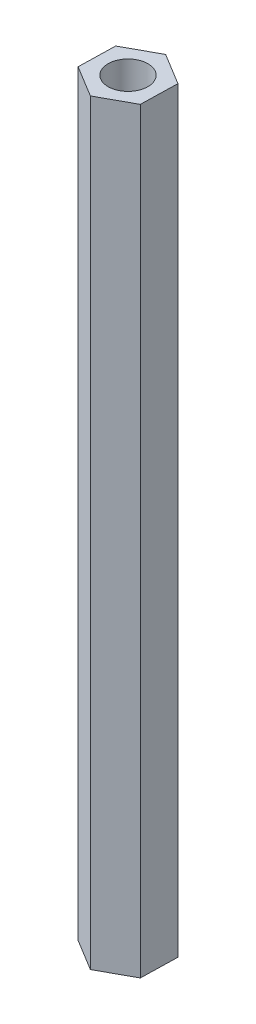
ISO-10303-21;
HEADER;
FILE_DESCRIPTION(('STEP AP214'),'2;1');
FILE_NAME('part.step','',(''),(''),'','','');
FILE_SCHEMA(('AUTOMOTIVE_DESIGN { 1 0 10303 214 1 1 1 1 }'));
ENDSEC;
DATA;
#1=APPLICATION_CONTEXT('core data for automotive mechanical design processes');
#2=APPLICATION_PROTOCOL_DEFINITION('international standard','automotive_design',2000,#1);
#3=PRODUCT_CONTEXT('',#1,'mechanical');
#4=PRODUCT('Part','Part','',(#3));
#5=PRODUCT_RELATED_PRODUCT_CATEGORY('part','',(#4));
#6=PRODUCT_DEFINITION_FORMATION('','',#4);
#7=PRODUCT_DEFINITION_CONTEXT('part definition',#1,'design');
#8=PRODUCT_DEFINITION('design','',#6,#7);
#9=PRODUCT_DEFINITION_SHAPE('','',#8);
#10=(LENGTH_UNIT() NAMED_UNIT(*) SI_UNIT(.MILLI.,.METRE.));
#11=(NAMED_UNIT(*) PLANE_ANGLE_UNIT() SI_UNIT($,.RADIAN.));
#12=(NAMED_UNIT(*) SI_UNIT($,.STERADIAN.) SOLID_ANGLE_UNIT());
#13=UNCERTAINTY_MEASURE_WITH_UNIT(LENGTH_MEASURE(1.E-05),#10,'distance_accuracy_value','');
#14=(GEOMETRIC_REPRESENTATION_CONTEXT(3) GLOBAL_UNCERTAINTY_ASSIGNED_CONTEXT((#13)) GLOBAL_UNIT_ASSIGNED_CONTEXT((#10,
#11,#12)) REPRESENTATION_CONTEXT('',''));
#15=CARTESIAN_POINT('',(0.,0.,0.));
#16=DIRECTION('',(0.,0.,1.));
#17=DIRECTION('',(1.,0.,0.));
#18=AXIS2_PLACEMENT_3D('',#15,#16,#17);
#19=CARTESIAN_POINT('',(3.94579096412522,47.5,2.4008471423148));
#20=DIRECTION('',(-0.999735132754464,0.,-0.0230144375645834));
#21=DIRECTION('',(-0.0230144375645834,0.,0.999735132754464));
#22=AXIS2_PLACEMENT_3D('',#19,#20,#21);
#23=PLANE('',#22);
#24=DIRECTION('',(0.0230144375645834,0.,-0.999735132754464));
#25=VECTOR('',#24,1.);
#26=CARTESIAN_POINT('',(3.94579096412522,-47.5,2.4008471423148));
#27=LINE('',#26,#25);
#28=CARTESIAN_POINT('',(3.94579096412522,-47.5,2.4008471423148));
#29=VERTEX_POINT('',#28);
#30=CARTESIAN_POINT('',(4.0520900979105,-47.5,-2.21673164179813));
#31=VERTEX_POINT('',#30);
#32=EDGE_CURVE('E125',#29,#31,#27,.T.);
#33=ORIENTED_EDGE('',*,*,#32,.T.);
#34=DIRECTION('',(0.,-1.,0.));
#35=VECTOR('',#34,1.);
#36=CARTESIAN_POINT('',(4.0520900979105,47.5,-2.21673164179813));
#37=LINE('',#36,#35);
#38=CARTESIAN_POINT('',(4.0520900979105,47.5,-2.21673164179813));
#39=VERTEX_POINT('',#38);
#40=EDGE_CURVE('E11',#39,#31,#37,.T.);
#41=ORIENTED_EDGE('',*,*,#40,.F.);
#42=DIRECTION('',(0.0230144375645834,0.,-0.999735132754464));
#43=VECTOR('',#42,1.);
#44=CARTESIAN_POINT('',(3.94579096412522,47.5,2.4008471423148));
#45=LINE('',#44,#43);
#46=CARTESIAN_POINT('',(3.94579096412522,47.5,2.4008471423148));
#47=VERTEX_POINT('',#46);
#48=EDGE_CURVE('E136',#47,#39,#45,.T.);
#49=ORIENTED_EDGE('',*,*,#48,.F.);
#50=DIRECTION('',(0.,-1.,0.));
#51=VECTOR('',#50,1.);
#52=CARTESIAN_POINT('',(3.94579096412522,47.5,2.4008471423148));
#53=LINE('',#52,#51);
#54=EDGE_CURVE('E121',#47,#29,#53,.T.);
#55=ORIENTED_EDGE('',*,*,#54,.T.);
#56=EDGE_LOOP('',(#33,#41,#49,#55));
#57=FACE_BOUND('',#56,.T.);
#58=ADVANCED_FACE('F39',(#57),#23,.F.);
#59=CARTESIAN_POINT('',(4.0520900979105,47.5,-2.21673164179813));
#60=DIRECTION('',(-0.519798653961972,0.,0.854288803238882));
#61=DIRECTION('',(0.854288803238882,0.,0.519798653961972));
#62=AXIS2_PLACEMENT_3D('',#59,#60,#61);
#63=PLANE('',#62);
#64=DIRECTION('',(-0.854288803238882,0.,-0.519798653961972));
#65=VECTOR('',#64,1.);
#66=CARTESIAN_POINT('',(4.0520900979105,-47.5,-2.21673164179813));
#67=LINE('',#66,#65);
#68=CARTESIAN_POINT('',(0.106299133785283,-47.5,-4.61757878411293));
#69=VERTEX_POINT('',#68);
#70=EDGE_CURVE('E128',#31,#69,#67,.T.);
#71=ORIENTED_EDGE('',*,*,#70,.T.);
#72=DIRECTION('',(0.,-1.,0.));
#73=VECTOR('',#72,1.);
#74=CARTESIAN_POINT('',(0.106299133785283,47.5,-4.61757878411293));
#75=LINE('',#74,#73);
#76=CARTESIAN_POINT('',(0.106299133785283,47.5,-4.61757878411293));
#77=VERTEX_POINT('',#76);
#78=EDGE_CURVE('E48',#77,#69,#75,.T.);
#79=ORIENTED_EDGE('',*,*,#78,.F.);
#80=DIRECTION('',(-0.854288803238882,0.,-0.519798653961972));
#81=VECTOR('',#80,1.);
#82=CARTESIAN_POINT('',(4.0520900979105,47.5,-2.21673164179813));
#83=LINE('',#82,#81);
#84=EDGE_CURVE('E94',#39,#77,#83,.T.);
#85=ORIENTED_EDGE('',*,*,#84,.F.);
#86=ORIENTED_EDGE('',*,*,#40,.T.);
#87=EDGE_LOOP('',(#71,#79,#85,#86));
#88=FACE_BOUND('',#87,.T.);
#89=ADVANCED_FACE('F156',(#88),#63,.F.);
#90=CARTESIAN_POINT('',(0.106299133785283,47.5,-4.61757878411293));
#91=DIRECTION('',(0.479936478792491,0.,0.877303240803466));
#92=DIRECTION('',(0.877303240803466,0.,-0.479936478792491));
#93=AXIS2_PLACEMENT_3D('',#90,#91,#92);
#94=PLANE('',#93);
#95=DIRECTION('',(-0.877303240803466,0.,0.479936478792491));
#96=VECTOR('',#95,1.);
#97=CARTESIAN_POINT('',(0.106299133785283,-47.5,-4.61757878411293));
#98=LINE('',#97,#96);
#99=CARTESIAN_POINT('',(-3.94579096412522,-47.5,-2.4008471423148));
#100=VERTEX_POINT('',#99);
#101=EDGE_CURVE('E131',#69,#100,#98,.T.);
#102=ORIENTED_EDGE('',*,*,#101,.T.);
#103=DIRECTION('',(0.,-1.,0.));
#104=VECTOR('',#103,1.);
#105=CARTESIAN_POINT('',(-3.94579096412522,47.5,-2.4008471423148));
#106=LINE('',#105,#104);
#107=CARTESIAN_POINT('',(-3.94579096412522,47.5,-2.4008471423148));
#108=VERTEX_POINT('',#107);
#109=EDGE_CURVE('E116',#108,#100,#106,.T.);
#110=ORIENTED_EDGE('',*,*,#109,.F.);
#111=DIRECTION('',(-0.877303240803466,0.,0.479936478792491));
#112=VECTOR('',#111,1.);
#113=CARTESIAN_POINT('',(0.106299133785283,47.5,-4.61757878411293));
#114=LINE('',#113,#112);
#115=EDGE_CURVE('E107',#77,#108,#114,.T.);
#116=ORIENTED_EDGE('',*,*,#115,.F.);
#117=ORIENTED_EDGE('',*,*,#78,.T.);
#118=EDGE_LOOP('',(#102,#110,#116,#117));
#119=FACE_BOUND('',#118,.T.);
#120=ADVANCED_FACE('F159',(#119),#94,.F.);
#121=CARTESIAN_POINT('',(-3.94579096412522,47.5,-2.4008471423148));
#122=DIRECTION('',(0.999735132754464,0.,0.0230144375645836));
#123=DIRECTION('',(0.0230144375645836,0.,-0.999735132754464));
#124=AXIS2_PLACEMENT_3D('',#121,#122,#123);
#125=PLANE('',#124);
#126=DIRECTION('',(-0.0230144375645836,0.,0.999735132754464));
#127=VECTOR('',#126,1.);
#128=CARTESIAN_POINT('',(-3.94579096412522,-47.5,-2.4008471423148));
#129=LINE('',#128,#127);
#130=CARTESIAN_POINT('',(-4.0520900979105,-47.5,2.21673164179813));
#131=VERTEX_POINT('',#130);
#132=EDGE_CURVE('E115',#100,#131,#129,.T.);
#133=ORIENTED_EDGE('',*,*,#132,.T.);
#134=DIRECTION('',(0.,-1.,0.));
#135=VECTOR('',#134,1.);
#136=CARTESIAN_POINT('',(-4.0520900979105,47.5,2.21673164179813));
#137=LINE('',#136,#135);
#138=CARTESIAN_POINT('',(-4.0520900979105,47.5,2.21673164179813));
#139=VERTEX_POINT('',#138);
#140=EDGE_CURVE('E112',#139,#131,#137,.T.);
#141=ORIENTED_EDGE('',*,*,#140,.F.);
#142=DIRECTION('',(-0.0230144375645836,0.,0.999735132754464));
#143=VECTOR('',#142,1.);
#144=CARTESIAN_POINT('',(-3.94579096412522,47.5,-2.4008471423148));
#145=LINE('',#144,#143);
#146=EDGE_CURVE('E101',#108,#139,#145,.T.);
#147=ORIENTED_EDGE('',*,*,#146,.F.);
#148=ORIENTED_EDGE('',*,*,#109,.T.);
#149=EDGE_LOOP('',(#133,#141,#147,#148));
#150=FACE_BOUND('',#149,.T.);
#151=ADVANCED_FACE('F113',(#150),#125,.F.);
#152=CARTESIAN_POINT('',(-4.0520900979105,47.5,2.21673164179813));
#153=DIRECTION('',(0.519798653961973,0.,-0.854288803238882));
#154=DIRECTION('',(-0.854288803238882,0.,-0.519798653961973));
#155=AXIS2_PLACEMENT_3D('',#152,#153,#154);
#156=PLANE('',#155);
#157=DIRECTION('',(0.854288803238882,0.,0.519798653961972));
#158=VECTOR('',#157,1.);
#159=CARTESIAN_POINT('',(-4.0520900979105,-47.5,2.21673164179813));
#160=LINE('',#159,#158);
#161=CARTESIAN_POINT('',(-0.106299133785281,-47.5,4.61757878411293));
#162=VERTEX_POINT('',#161);
#163=EDGE_CURVE('E80',#131,#162,#160,.T.);
#164=ORIENTED_EDGE('',*,*,#163,.T.);
#165=DIRECTION('',(0.,-1.,0.));
#166=VECTOR('',#165,1.);
#167=CARTESIAN_POINT('',(-0.106299133785281,47.5,4.61757878411293));
#168=LINE('',#167,#166);
#169=CARTESIAN_POINT('',(-0.106299133785281,47.5,4.61757878411293));
#170=VERTEX_POINT('',#169);
#171=EDGE_CURVE('E117',#170,#162,#168,.T.);
#172=ORIENTED_EDGE('',*,*,#171,.F.);
#173=DIRECTION('',(0.854288803238882,0.,0.519798653961972));
#174=VECTOR('',#173,1.);
#175=CARTESIAN_POINT('',(-4.0520900979105,47.5,2.21673164179813));
#176=LINE('',#175,#174);
#177=EDGE_CURVE('E105',#139,#170,#176,.T.);
#178=ORIENTED_EDGE('',*,*,#177,.F.);
#179=ORIENTED_EDGE('',*,*,#140,.T.);
#180=EDGE_LOOP('',(#164,#172,#178,#179));
#181=FACE_BOUND('',#180,.T.);
#182=ADVANCED_FACE('F119',(#181),#156,.F.);
#183=CARTESIAN_POINT('',(-0.106299133785281,47.5,4.61757878411293));
#184=DIRECTION('',(-0.479936478792491,0.,-0.877303240803466));
#185=DIRECTION('',(-0.877303240803466,0.,0.479936478792492));
#186=AXIS2_PLACEMENT_3D('',#183,#184,#185);
#187=PLANE('',#186);
#188=DIRECTION('',(0.877303240803466,0.,-0.479936478792491));
#189=VECTOR('',#188,1.);
#190=CARTESIAN_POINT('',(-0.106299133785281,-47.5,4.61757878411293));
#191=LINE('',#190,#189);
#192=EDGE_CURVE('E86',#162,#29,#191,.T.);
#193=ORIENTED_EDGE('',*,*,#192,.T.);
#194=ORIENTED_EDGE('',*,*,#54,.F.);
#195=DIRECTION('',(0.877303240803466,0.,-0.479936478792491));
#196=VECTOR('',#195,1.);
#197=CARTESIAN_POINT('',(-0.106299133785281,47.5,4.61757878411293));
#198=LINE('',#197,#196);
#199=EDGE_CURVE('E57',#170,#47,#198,.T.);
#200=ORIENTED_EDGE('',*,*,#199,.F.);
#201=ORIENTED_EDGE('',*,*,#171,.T.);
#202=EDGE_LOOP('',(#193,#194,#200,#201));
#203=FACE_BOUND('',#202,.T.);
#204=ADVANCED_FACE('F164',(#203),#187,.F.);
#205=CARTESIAN_POINT('',(0.,47.5,0.));
#206=DIRECTION('',(0.,1.,0.));
#207=DIRECTION('',(0.,0.,1.));
#208=AXIS2_PLACEMENT_3D('',#205,#206,#207);
#209=PLANE('',#208);
#210=CARTESIAN_POINT('',(0.,47.5,0.));
#211=DIRECTION('',(0.,1.,0.));
#212=DIRECTION('',(0.,0.,1.));
#213=AXIS2_PLACEMENT_3D('',#210,#211,#212);
#214=CIRCLE('',#213,2.5);
#215=CARTESIAN_POINT('',(0.,47.5,2.5));
#216=VERTEX_POINT('',#215);
#217=EDGE_CURVE('E129',#216,#216,#214,.T.);
#218=ORIENTED_EDGE('',*,*,#217,.F.);
#219=EDGE_LOOP('',(#218));
#220=FACE_BOUND('',#219,.T.);
#221=ORIENTED_EDGE('',*,*,#48,.T.);
#222=ORIENTED_EDGE('',*,*,#84,.T.);
#223=ORIENTED_EDGE('',*,*,#115,.T.);
#224=ORIENTED_EDGE('',*,*,#146,.T.);
#225=ORIENTED_EDGE('',*,*,#177,.T.);
#226=ORIENTED_EDGE('',*,*,#199,.T.);
#227=EDGE_LOOP('',(#221,#222,#223,#224,#225,#226));
#228=FACE_BOUND('',#227,.T.);
#229=ADVANCED_FACE('F103',(#220,#228),#209,.T.);
#230=CARTESIAN_POINT('',(0.,-47.5,0.));
#231=DIRECTION('',(0.,1.,0.));
#232=DIRECTION('',(0.,0.,1.));
#233=AXIS2_PLACEMENT_3D('',#230,#231,#232);
#234=PLANE('',#233);
#235=CARTESIAN_POINT('',(0.,-47.5,0.));
#236=DIRECTION('',(0.,1.,0.));
#237=DIRECTION('',(0.,0.,1.));
#238=AXIS2_PLACEMENT_3D('',#235,#236,#237);
#239=CIRCLE('',#238,2.5);
#240=CARTESIAN_POINT('',(0.,-47.5,2.5));
#241=VERTEX_POINT('',#240);
#242=EDGE_CURVE('E42',#241,#241,#239,.F.);
#243=ORIENTED_EDGE('',*,*,#242,.F.);
#244=EDGE_LOOP('',(#243));
#245=FACE_BOUND('',#244,.T.);
#246=ORIENTED_EDGE('',*,*,#32,.F.);
#247=ORIENTED_EDGE('',*,*,#192,.F.);
#248=ORIENTED_EDGE('',*,*,#163,.F.);
#249=ORIENTED_EDGE('',*,*,#132,.F.);
#250=ORIENTED_EDGE('',*,*,#101,.F.);
#251=ORIENTED_EDGE('',*,*,#70,.F.);
#252=EDGE_LOOP('',(#246,#247,#248,#249,#250,#251));
#253=FACE_BOUND('',#252,.T.);
#254=ADVANCED_FACE('F162',(#245,#253),#234,.F.);
#255=CARTESIAN_POINT('',(0.,34.,0.));
#256=DIRECTION('',(0.,1.,0.));
#257=DIRECTION('',(0.,0.,1.));
#258=AXIS2_PLACEMENT_3D('',#255,#256,#257);
#259=CYLINDRICAL_SURFACE('',#258,2.5);
#260=ORIENTED_EDGE('',*,*,#217,.T.);
#261=EDGE_LOOP('',(#260));
#262=FACE_BOUND('',#261,.T.);
#263=CARTESIAN_POINT('',(0.,34.,0.));
#264=DIRECTION('',(0.,1.,0.));
#265=DIRECTION('',(0.,0.,1.));
#266=AXIS2_PLACEMENT_3D('',#263,#264,#265);
#267=CIRCLE('',#266,2.5);
#268=CARTESIAN_POINT('',(0.,34.,2.5));
#269=VERTEX_POINT('',#268);
#270=EDGE_CURVE('E142',#269,#269,#267,.T.);
#271=ORIENTED_EDGE('',*,*,#270,.F.);
#272=EDGE_LOOP('',(#271));
#273=FACE_BOUND('',#272,.T.);
#274=ADVANCED_FACE('F210',(#262,#273),#259,.F.);
#275=CARTESIAN_POINT('',(0.,34.,0.));
#276=DIRECTION('',(0.,1.,0.));
#277=DIRECTION('',(0.,0.,1.));
#278=AXIS2_PLACEMENT_3D('',#275,#276,#277);
#279=PLANE('',#278);
#280=ORIENTED_EDGE('',*,*,#270,.T.);
#281=EDGE_LOOP('',(#280));
#282=FACE_BOUND('',#281,.T.);
#283=ADVANCED_FACE('F215',(#282),#279,.T.);
#284=CARTESIAN_POINT('',(0.,-34.,0.));
#285=DIRECTION('',(0.,-1.,0.));
#286=DIRECTION('',(0.,0.,-1.));
#287=AXIS2_PLACEMENT_3D('',#284,#285,#286);
#288=CYLINDRICAL_SURFACE('',#287,2.5);
#289=CARTESIAN_POINT('',(0.,-34.,0.));
#290=DIRECTION('',(0.,1.,0.));
#291=DIRECTION('',(0.,0.,1.));
#292=AXIS2_PLACEMENT_3D('',#289,#290,#291);
#293=CIRCLE('',#292,2.5);
#294=CARTESIAN_POINT('',(0.,-34.,2.5));
#295=VERTEX_POINT('',#294);
#296=EDGE_CURVE('E150',#295,#295,#293,.T.);
#297=ORIENTED_EDGE('',*,*,#296,.T.);
#298=EDGE_LOOP('',(#297));
#299=FACE_BOUND('',#298,.T.);
#300=ORIENTED_EDGE('',*,*,#242,.T.);
#301=EDGE_LOOP('',(#300));
#302=FACE_BOUND('',#301,.T.);
#303=ADVANCED_FACE('F224',(#299,#302),#288,.F.);
#304=CARTESIAN_POINT('',(0.,-34.,0.));
#305=DIRECTION('',(0.,1.,0.));
#306=DIRECTION('',(0.,0.,1.));
#307=AXIS2_PLACEMENT_3D('',#304,#305,#306);
#308=PLANE('',#307);
#309=ORIENTED_EDGE('',*,*,#296,.F.);
#310=EDGE_LOOP('',(#309));
#311=FACE_BOUND('',#310,.T.);
#312=ADVANCED_FACE('F239',(#311),#308,.F.);
#313=CLOSED_SHELL('',(#58,#89,#120,#151,#182,#204,#229,#254,#274,#283,#303,#312));
#314=MANIFOLD_SOLID_BREP('B2',#313);
#315=ADVANCED_BREP_SHAPE_REPRESENTATION('',(#18,#314),#14);
#316=SHAPE_DEFINITION_REPRESENTATION(#9,#315);
ENDSEC;
END-ISO-10303-21;
